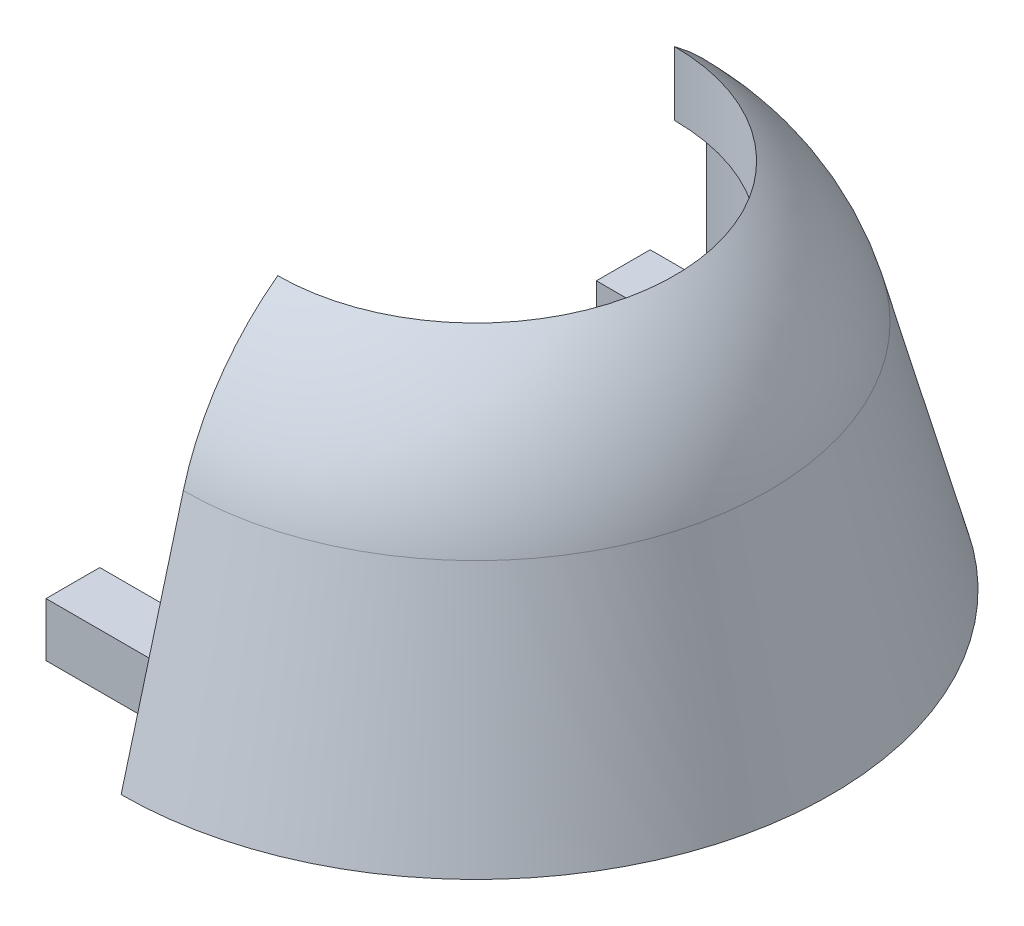
ISO-10303-21;
HEADER;
FILE_DESCRIPTION(('STEP AP214'),'2;1');
FILE_NAME('part.step','',(''),(''),'','','');
FILE_SCHEMA(('AUTOMOTIVE_DESIGN { 1 0 10303 214 1 1 1 1 }'));
ENDSEC;
DATA;
#1=APPLICATION_CONTEXT('core data for automotive mechanical design processes');
#2=APPLICATION_PROTOCOL_DEFINITION('international standard','automotive_design',2000,#1);
#3=PRODUCT_CONTEXT('',#1,'mechanical');
#4=PRODUCT('Part','Part','',(#3));
#5=PRODUCT_RELATED_PRODUCT_CATEGORY('part','',(#4));
#6=PRODUCT_DEFINITION_FORMATION('','',#4);
#7=PRODUCT_DEFINITION_CONTEXT('part definition',#1,'design');
#8=PRODUCT_DEFINITION('design','',#6,#7);
#9=PRODUCT_DEFINITION_SHAPE('','',#8);
#10=(LENGTH_UNIT() NAMED_UNIT(*) SI_UNIT(.MILLI.,.METRE.));
#11=(NAMED_UNIT(*) PLANE_ANGLE_UNIT() SI_UNIT($,.RADIAN.));
#12=(NAMED_UNIT(*) SI_UNIT($,.STERADIAN.) SOLID_ANGLE_UNIT());
#13=UNCERTAINTY_MEASURE_WITH_UNIT(LENGTH_MEASURE(1.E-05),#10,'distance_accuracy_value','');
#14=(GEOMETRIC_REPRESENTATION_CONTEXT(3) GLOBAL_UNCERTAINTY_ASSIGNED_CONTEXT((#13)) GLOBAL_UNIT_ASSIGNED_CONTEXT((#10,
#11,#12)) REPRESENTATION_CONTEXT('',''));
#15=CARTESIAN_POINT('',(0.,0.,0.));
#16=DIRECTION('',(0.,0.,1.));
#17=DIRECTION('',(1.,0.,0.));
#18=AXIS2_PLACEMENT_3D('',#15,#16,#17);
#19=CARTESIAN_POINT('',(0.,24.,18.));
#20=DIRECTION('',(1.,0.,0.));
#21=DIRECTION('',(0.,0.,-1.));
#22=AXIS2_PLACEMENT_3D('',#19,#20,#21);
#23=PLANE('',#22);
#24=DIRECTION('',(0.,-0.965925826289066,0.258819045102528));
#25=VECTOR('',#24,1.);
#26=CARTESIAN_POINT('',(0.,103.497422611925,0.));
#27=LINE('',#26,#25);
#28=CARTESIAN_POINT('',(0.,0.,27.7320508075689));
#29=VERTEX_POINT('',#28);
#30=CARTESIAN_POINT('',(0.,18.1360214514236,22.8725185057462));
#31=VERTEX_POINT('',#30);
#32=EDGE_CURVE('E267',#29,#31,#27,.F.);
#33=ORIENTED_EDGE('',*,*,#32,.T.);
#34=CARTESIAN_POINT('',(0.,12.959640549373,3.55400197996491));
#35=DIRECTION('',(1.,0.,0.));
#36=DIRECTION('',(0.,0.,-1.));
#37=AXIS2_PLACEMENT_3D('',#34,#35,#36);
#38=CIRCLE('',#37,20.);
#39=CARTESIAN_POINT('',(0.,29.,15.5));
#40=VERTEX_POINT('',#39);
#41=EDGE_CURVE('E11',#31,#40,#38,.F.);
#42=ORIENTED_EDGE('',*,*,#41,.T.);
#43=DIRECTION('',(0.,-1.,0.));
#44=VECTOR('',#43,1.);
#45=CARTESIAN_POINT('',(0.,29.,15.5));
#46=LINE('',#45,#44);
#47=CARTESIAN_POINT('',(0.,24.,15.5));
#48=VERTEX_POINT('',#47);
#49=EDGE_CURVE('E222',#40,#48,#46,.T.);
#50=ORIENTED_EDGE('',*,*,#49,.T.);
#51=DIRECTION('',(0.,0.,1.));
#52=VECTOR('',#51,1.);
#53=CARTESIAN_POINT('',(0.,24.,28.));
#54=LINE('',#53,#52);
#55=CARTESIAN_POINT('',(0.,24.,18.));
#56=VERTEX_POINT('',#55);
#57=EDGE_CURVE('E223',#48,#56,#54,.T.);
#58=ORIENTED_EDGE('',*,*,#57,.T.);
#59=DIRECTION('',(0.,-1.,0.));
#60=VECTOR('',#59,1.);
#61=CARTESIAN_POINT('',(0.,24.,18.));
#62=LINE('',#61,#60);
#63=CARTESIAN_POINT('',(0.,0.,18.));
#64=VERTEX_POINT('',#63);
#65=EDGE_CURVE('E244',#56,#64,#62,.T.);
#66=ORIENTED_EDGE('',*,*,#65,.T.);
#67=DIRECTION('',(0.,0.,1.));
#68=VECTOR('',#67,1.);
#69=CARTESIAN_POINT('',(0.,0.,18.));
#70=LINE('',#69,#68);
#71=EDGE_CURVE('E245',#64,#29,#70,.T.);
#72=ORIENTED_EDGE('',*,*,#71,.T.);
#73=EDGE_LOOP('',(#33,#42,#50,#58,#66,#72));
#74=FACE_BOUND('',#73,.T.);
#75=DIRECTION('',(0.,1.,0.));
#76=VECTOR('',#75,1.);
#77=CARTESIAN_POINT('',(0.,6.2,23.6));
#78=LINE('',#77,#76);
#79=CARTESIAN_POINT('',(0.,2.,23.6));
#80=VERTEX_POINT('',#79);
#81=CARTESIAN_POINT('',(0.,6.2,23.6));
#82=VERTEX_POINT('',#81);
#83=EDGE_CURVE('E164',#80,#82,#78,.T.);
#84=ORIENTED_EDGE('',*,*,#83,.F.);
#85=DIRECTION('',(0.,0.,1.));
#86=VECTOR('',#85,1.);
#87=CARTESIAN_POINT('',(0.,2.,19.4));
#88=LINE('',#87,#86);
#89=CARTESIAN_POINT('',(0.,2.,19.4));
#90=VERTEX_POINT('',#89);
#91=EDGE_CURVE('E161',#90,#80,#88,.T.);
#92=ORIENTED_EDGE('',*,*,#91,.F.);
#93=DIRECTION('',(0.,-1.,0.));
#94=VECTOR('',#93,1.);
#95=CARTESIAN_POINT('',(0.,6.2,19.4));
#96=LINE('',#95,#94);
#97=CARTESIAN_POINT('',(0.,6.2,19.4));
#98=VERTEX_POINT('',#97);
#99=EDGE_CURVE('E62',#98,#90,#96,.T.);
#100=ORIENTED_EDGE('',*,*,#99,.F.);
#101=DIRECTION('',(0.,0.,-1.));
#102=VECTOR('',#101,1.);
#103=CARTESIAN_POINT('',(0.,6.2,19.4));
#104=LINE('',#103,#102);
#105=EDGE_CURVE('E57',#82,#98,#104,.T.);
#106=ORIENTED_EDGE('',*,*,#105,.F.);
#107=EDGE_LOOP('',(#84,#92,#100,#106));
#108=FACE_BOUND('',#107,.T.);
#109=ADVANCED_FACE('F41',(#74,#108),#23,.F.);
#110=CARTESIAN_POINT('',(0.,24.,-28.));
#111=DIRECTION('',(1.,0.,0.));
#112=DIRECTION('',(0.,0.,-1.));
#113=AXIS2_PLACEMENT_3D('',#110,#111,#112);
#114=PLANE('',#113);
#115=DIRECTION('',(0.,-1.,0.));
#116=VECTOR('',#115,1.);
#117=CARTESIAN_POINT('',(0.,29.,-15.5));
#118=LINE('',#117,#116);
#119=CARTESIAN_POINT('',(0.,29.,-15.5));
#120=VERTEX_POINT('',#119);
#121=CARTESIAN_POINT('',(0.,24.,-15.5));
#122=VERTEX_POINT('',#121);
#123=EDGE_CURVE('E235',#120,#122,#118,.T.);
#124=ORIENTED_EDGE('',*,*,#123,.F.);
#125=CARTESIAN_POINT('',(0.,12.959640549373,-3.55400197996491));
#126=DIRECTION('',(1.,0.,0.));
#127=DIRECTION('',(0.,0.,-1.));
#128=AXIS2_PLACEMENT_3D('',#125,#126,#127);
#129=CIRCLE('',#128,20.);
#130=CARTESIAN_POINT('',(0.,18.1360214514236,-22.8725185057462));
#131=VERTEX_POINT('',#130);
#132=EDGE_CURVE('E271',#120,#131,#129,.F.);
#133=ORIENTED_EDGE('',*,*,#132,.T.);
#134=DIRECTION('',(0.,0.965925826289066,0.258819045102528));
#135=VECTOR('',#134,1.);
#136=CARTESIAN_POINT('',(0.,103.497422611925,0.));
#137=LINE('',#136,#135);
#138=CARTESIAN_POINT('',(0.,0.,-27.7320508075689));
#139=VERTEX_POINT('',#138);
#140=EDGE_CURVE('E261',#131,#139,#137,.F.);
#141=ORIENTED_EDGE('',*,*,#140,.T.);
#142=DIRECTION('',(0.,0.,1.));
#143=VECTOR('',#142,1.);
#144=CARTESIAN_POINT('',(0.,0.,-28.));
#145=LINE('',#144,#143);
#146=CARTESIAN_POINT('',(0.,0.,-18.));
#147=VERTEX_POINT('',#146);
#148=EDGE_CURVE('E239',#139,#147,#145,.T.);
#149=ORIENTED_EDGE('',*,*,#148,.T.);
#150=DIRECTION('',(0.,-1.,0.));
#151=VECTOR('',#150,1.);
#152=CARTESIAN_POINT('',(0.,24.,-18.));
#153=LINE('',#152,#151);
#154=CARTESIAN_POINT('',(0.,24.,-18.));
#155=VERTEX_POINT('',#154);
#156=EDGE_CURVE('E257',#155,#147,#153,.T.);
#157=ORIENTED_EDGE('',*,*,#156,.F.);
#158=DIRECTION('',(0.,0.,1.));
#159=VECTOR('',#158,1.);
#160=CARTESIAN_POINT('',(0.,24.,-28.));
#161=LINE('',#160,#159);
#162=EDGE_CURVE('E217',#155,#122,#161,.T.);
#163=ORIENTED_EDGE('',*,*,#162,.T.);
#164=EDGE_LOOP('',(#124,#133,#141,#149,#157,#163));
#165=FACE_BOUND('',#164,.T.);
#166=DIRECTION('',(0.,1.,0.));
#167=VECTOR('',#166,1.);
#168=CARTESIAN_POINT('',(0.,6.2,-19.4));
#169=LINE('',#168,#167);
#170=CARTESIAN_POINT('',(0.,2.,-19.4));
#171=VERTEX_POINT('',#170);
#172=CARTESIAN_POINT('',(0.,6.2,-19.4));
#173=VERTEX_POINT('',#172);
#174=EDGE_CURVE('E166',#171,#173,#169,.T.);
#175=ORIENTED_EDGE('',*,*,#174,.F.);
#176=DIRECTION('',(0.,0.,1.));
#177=VECTOR('',#176,1.);
#178=CARTESIAN_POINT('',(0.,2.,-23.6));
#179=LINE('',#178,#177);
#180=CARTESIAN_POINT('',(0.,2.,-23.6));
#181=VERTEX_POINT('',#180);
#182=EDGE_CURVE('E182',#181,#171,#179,.T.);
#183=ORIENTED_EDGE('',*,*,#182,.F.);
#184=DIRECTION('',(0.,-1.,0.));
#185=VECTOR('',#184,1.);
#186=CARTESIAN_POINT('',(0.,6.2,-23.6));
#187=LINE('',#186,#185);
#188=CARTESIAN_POINT('',(0.,6.2,-23.6));
#189=VERTEX_POINT('',#188);
#190=EDGE_CURVE('E195',#189,#181,#187,.T.);
#191=ORIENTED_EDGE('',*,*,#190,.F.);
#192=DIRECTION('',(0.,0.,-1.));
#193=VECTOR('',#192,1.);
#194=CARTESIAN_POINT('',(0.,6.2,-23.6));
#195=LINE('',#194,#193);
#196=EDGE_CURVE('E171',#173,#189,#195,.T.);
#197=ORIENTED_EDGE('',*,*,#196,.F.);
#198=EDGE_LOOP('',(#175,#183,#191,#197));
#199=FACE_BOUND('',#198,.T.);
#200=ADVANCED_FACE('F302',(#165,#199),#114,.F.);
#201=CARTESIAN_POINT('',(0.,24.,0.));
#202=DIRECTION('',(0.,-1.,0.));
#203=DIRECTION('',(0.,0.,-1.));
#204=AXIS2_PLACEMENT_3D('',#201,#202,#203);
#205=CYLINDRICAL_SURFACE('',#204,18.);
#206=CARTESIAN_POINT('',(0.,0.,0.));
#207=DIRECTION('',(0.,-1.,0.));
#208=DIRECTION('',(0.,0.,1.));
#209=AXIS2_PLACEMENT_3D('',#206,#207,#208);
#210=CIRCLE('',#209,18.);
#211=EDGE_CURVE('E248',#147,#64,#210,.T.);
#212=ORIENTED_EDGE('',*,*,#211,.T.);
#213=ORIENTED_EDGE('',*,*,#65,.F.);
#214=CARTESIAN_POINT('',(0.,24.,0.));
#215=DIRECTION('',(0.,-1.,0.));
#216=DIRECTION('',(0.,0.,1.));
#217=AXIS2_PLACEMENT_3D('',#214,#215,#216);
#218=CIRCLE('',#217,18.);
#219=EDGE_CURVE('E240',#155,#56,#218,.T.);
#220=ORIENTED_EDGE('',*,*,#219,.F.);
#221=ORIENTED_EDGE('',*,*,#156,.T.);
#222=EDGE_LOOP('',(#212,#213,#220,#221));
#223=FACE_BOUND('',#222,.T.);
#224=ADVANCED_FACE('F296',(#223),#205,.F.);
#225=CARTESIAN_POINT('',(0.,0.,0.));
#226=DIRECTION('',(0.,1.,0.));
#227=DIRECTION('',(0.,0.,1.));
#228=AXIS2_PLACEMENT_3D('',#225,#226,#227);
#229=PLANE('',#228);
#230=ORIENTED_EDGE('',*,*,#148,.F.);
#231=CARTESIAN_POINT('',(0.,0.,0.));
#232=DIRECTION('',(0.,1.,0.));
#233=DIRECTION('',(0.,0.,1.));
#234=AXIS2_PLACEMENT_3D('',#231,#232,#233);
#235=CIRCLE('',#234,27.7320508075689);
#236=EDGE_CURVE('E264',#139,#29,#235,.F.);
#237=ORIENTED_EDGE('',*,*,#236,.T.);
#238=ORIENTED_EDGE('',*,*,#71,.F.);
#239=ORIENTED_EDGE('',*,*,#211,.F.);
#240=EDGE_LOOP('',(#230,#237,#238,#239));
#241=FACE_BOUND('',#240,.T.);
#242=ADVANCED_FACE('F300',(#241),#229,.F.);
#243=CARTESIAN_POINT('',(0.,24.,0.));
#244=DIRECTION('',(0.,1.,0.));
#245=DIRECTION('',(0.,0.,1.));
#246=AXIS2_PLACEMENT_3D('',#243,#244,#245);
#247=PLANE('',#246);
#248=ORIENTED_EDGE('',*,*,#162,.F.);
#249=ORIENTED_EDGE('',*,*,#219,.T.);
#250=ORIENTED_EDGE('',*,*,#57,.F.);
#251=CARTESIAN_POINT('',(0.,24.,0.));
#252=DIRECTION('',(0.,-1.,0.));
#253=DIRECTION('',(0.,0.,1.));
#254=AXIS2_PLACEMENT_3D('',#251,#252,#253);
#255=CIRCLE('',#254,15.5);
#256=EDGE_CURVE('E226',#122,#48,#255,.T.);
#257=ORIENTED_EDGE('',*,*,#256,.F.);
#258=EDGE_LOOP('',(#248,#249,#250,#257));
#259=FACE_BOUND('',#258,.T.);
#260=ADVANCED_FACE('F293',(#259),#247,.F.);
#261=CARTESIAN_POINT('',(0.,29.,0.));
#262=DIRECTION('',(0.,-1.,0.));
#263=DIRECTION('',(0.,0.,-1.));
#264=AXIS2_PLACEMENT_3D('',#261,#262,#263);
#265=CYLINDRICAL_SURFACE('',#264,15.5);
#266=ORIENTED_EDGE('',*,*,#256,.T.);
#267=ORIENTED_EDGE('',*,*,#49,.F.);
#268=CARTESIAN_POINT('',(0.,29.,0.));
#269=DIRECTION('',(0.,-1.,0.));
#270=DIRECTION('',(0.,0.,1.));
#271=AXIS2_PLACEMENT_3D('',#268,#269,#270);
#272=CIRCLE('',#271,15.5);
#273=EDGE_CURVE('E218',#120,#40,#272,.T.);
#274=ORIENTED_EDGE('',*,*,#273,.F.);
#275=ORIENTED_EDGE('',*,*,#123,.T.);
#276=EDGE_LOOP('',(#266,#267,#274,#275));
#277=FACE_BOUND('',#276,.T.);
#278=ADVANCED_FACE('F288',(#277),#265,.F.);
#279=CARTESIAN_POINT('',(0.,29.,0.));
#280=DIRECTION('',(0.,-1.,0.));
#281=DIRECTION('',(0.,0.,-1.));
#282=AXIS2_PLACEMENT_3D('',#279,#280,#281);
#283=CONICAL_SURFACE('',#282,19.9615242270661,0.261799387799157);
#284=ORIENTED_EDGE('',*,*,#140,.F.);
#285=CARTESIAN_POINT('',(0.,18.1360214514236,0.));
#286=DIRECTION('',(0.,-1.,0.));
#287=DIRECTION('',(0.,0.,-1.));
#288=AXIS2_PLACEMENT_3D('',#285,#286,#287);
#289=CIRCLE('',#288,22.8725185057462);
#290=EDGE_CURVE('E50',#131,#31,#289,.T.);
#291=ORIENTED_EDGE('',*,*,#290,.T.);
#292=ORIENTED_EDGE('',*,*,#32,.F.);
#293=ORIENTED_EDGE('',*,*,#236,.F.);
#294=EDGE_LOOP('',(#284,#291,#292,#293));
#295=FACE_BOUND('',#294,.T.);
#296=ADVANCED_FACE('F278',(#295),#283,.T.);
#297=CARTESIAN_POINT('',(0.,12.959640549373,0.));
#298=DIRECTION('',(0.,1.,0.));
#299=DIRECTION('',(0.,0.,1.));
#300=AXIS2_PLACEMENT_3D('',#297,#298,#299);
#301=DEGENERATE_TOROIDAL_SURFACE('',#300,3.55400197996491,20.,.T.);
#302=ORIENTED_EDGE('',*,*,#41,.F.);
#303=ORIENTED_EDGE('',*,*,#290,.F.);
#304=ORIENTED_EDGE('',*,*,#132,.F.);
#305=ORIENTED_EDGE('',*,*,#273,.T.);
#306=EDGE_LOOP('',(#302,#303,#304,#305));
#307=FACE_BOUND('',#306,.T.);
#308=ADVANCED_FACE('F43',(#307),#301,.T.);
#309=CARTESIAN_POINT('',(-9.99999999999999,6.2,-19.4));
#310=DIRECTION('',(0.,0.,-1.));
#311=DIRECTION('',(-1.,0.,0.));
#312=AXIS2_PLACEMENT_3D('',#309,#310,#311);
#313=PLANE('',#312);
#314=ORIENTED_EDGE('',*,*,#174,.T.);
#315=DIRECTION('',(1.,0.,0.));
#316=VECTOR('',#315,1.);
#317=CARTESIAN_POINT('',(-9.99999999999999,6.2,-19.4));
#318=LINE('',#317,#316);
#319=CARTESIAN_POINT('',(-9.99999999999999,6.2,-19.4));
#320=VERTEX_POINT('',#319);
#321=EDGE_CURVE('E213',#320,#173,#318,.T.);
#322=ORIENTED_EDGE('',*,*,#321,.F.);
#323=DIRECTION('',(0.,1.,0.));
#324=VECTOR('',#323,1.);
#325=CARTESIAN_POINT('',(-9.99999999999999,6.2,-19.4));
#326=LINE('',#325,#324);
#327=CARTESIAN_POINT('',(-9.99999999999999,2.,-19.4));
#328=VERTEX_POINT('',#327);
#329=EDGE_CURVE('E177',#328,#320,#326,.T.);
#330=ORIENTED_EDGE('',*,*,#329,.F.);
#331=DIRECTION('',(1.,0.,0.));
#332=VECTOR('',#331,1.);
#333=CARTESIAN_POINT('',(-9.99999999999999,2.,-19.4));
#334=LINE('',#333,#332);
#335=EDGE_CURVE('E190',#328,#171,#334,.T.);
#336=ORIENTED_EDGE('',*,*,#335,.T.);
#337=EDGE_LOOP('',(#314,#322,#330,#336));
#338=FACE_BOUND('',#337,.T.);
#339=ADVANCED_FACE('F314',(#338),#313,.F.);
#340=CARTESIAN_POINT('',(-9.99999999999999,6.2,-23.6));
#341=DIRECTION('',(0.,-1.,0.));
#342=DIRECTION('',(0.,0.,-1.));
#343=AXIS2_PLACEMENT_3D('',#340,#341,#342);
#344=PLANE('',#343);
#345=ORIENTED_EDGE('',*,*,#196,.T.);
#346=DIRECTION('',(1.,0.,0.));
#347=VECTOR('',#346,1.);
#348=CARTESIAN_POINT('',(-9.99999999999999,6.2,-23.6));
#349=LINE('',#348,#347);
#350=CARTESIAN_POINT('',(-9.99999999999999,6.2,-23.6));
#351=VERTEX_POINT('',#350);
#352=EDGE_CURVE('E209',#351,#189,#349,.T.);
#353=ORIENTED_EDGE('',*,*,#352,.F.);
#354=DIRECTION('',(0.,0.,-1.));
#355=VECTOR('',#354,1.);
#356=CARTESIAN_POINT('',(-9.99999999999999,6.2,-23.6));
#357=LINE('',#356,#355);
#358=EDGE_CURVE('E181',#320,#351,#357,.T.);
#359=ORIENTED_EDGE('',*,*,#358,.F.);
#360=ORIENTED_EDGE('',*,*,#321,.T.);
#361=EDGE_LOOP('',(#345,#353,#359,#360));
#362=FACE_BOUND('',#361,.T.);
#363=ADVANCED_FACE('F322',(#362),#344,.F.);
#364=CARTESIAN_POINT('',(-9.99999999999999,6.2,-23.6));
#365=DIRECTION('',(0.,0.,1.));
#366=DIRECTION('',(1.,0.,0.));
#367=AXIS2_PLACEMENT_3D('',#364,#365,#366);
#368=PLANE('',#367);
#369=ORIENTED_EDGE('',*,*,#190,.T.);
#370=DIRECTION('',(1.,0.,0.));
#371=VECTOR('',#370,1.);
#372=CARTESIAN_POINT('',(-9.99999999999999,2.,-23.6));
#373=LINE('',#372,#371);
#374=CARTESIAN_POINT('',(-9.99999999999999,2.,-23.6));
#375=VERTEX_POINT('',#374);
#376=EDGE_CURVE('E205',#375,#181,#373,.T.);
#377=ORIENTED_EDGE('',*,*,#376,.F.);
#378=DIRECTION('',(0.,-1.,0.));
#379=VECTOR('',#378,1.);
#380=CARTESIAN_POINT('',(-9.99999999999999,6.2,-23.6));
#381=LINE('',#380,#379);
#382=EDGE_CURVE('E185',#351,#375,#381,.T.);
#383=ORIENTED_EDGE('',*,*,#382,.F.);
#384=ORIENTED_EDGE('',*,*,#352,.T.);
#385=EDGE_LOOP('',(#369,#377,#383,#384));
#386=FACE_BOUND('',#385,.T.);
#387=ADVANCED_FACE('F320',(#386),#368,.F.);
#388=CARTESIAN_POINT('',(-9.99999999999999,2.,-23.6));
#389=DIRECTION('',(0.,1.,0.));
#390=DIRECTION('',(0.,0.,1.));
#391=AXIS2_PLACEMENT_3D('',#388,#389,#390);
#392=PLANE('',#391);
#393=ORIENTED_EDGE('',*,*,#182,.T.);
#394=ORIENTED_EDGE('',*,*,#335,.F.);
#395=DIRECTION('',(0.,0.,1.));
#396=VECTOR('',#395,1.);
#397=CARTESIAN_POINT('',(-9.99999999999999,2.,-23.6));
#398=LINE('',#397,#396);
#399=EDGE_CURVE('E188',#375,#328,#398,.T.);
#400=ORIENTED_EDGE('',*,*,#399,.F.);
#401=ORIENTED_EDGE('',*,*,#376,.T.);
#402=EDGE_LOOP('',(#393,#394,#400,#401));
#403=FACE_BOUND('',#402,.T.);
#404=ADVANCED_FACE('F310',(#403),#392,.F.);
#405=CARTESIAN_POINT('',(-10.,0.,0.));
#406=DIRECTION('',(-1.,0.,0.));
#407=DIRECTION('',(0.,0.,1.));
#408=AXIS2_PLACEMENT_3D('',#405,#406,#407);
#409=PLANE('',#408);
#410=ORIENTED_EDGE('',*,*,#329,.T.);
#411=ORIENTED_EDGE('',*,*,#358,.T.);
#412=ORIENTED_EDGE('',*,*,#382,.T.);
#413=ORIENTED_EDGE('',*,*,#399,.T.);
#414=EDGE_LOOP('',(#410,#411,#412,#413));
#415=FACE_BOUND('',#414,.T.);
#416=ADVANCED_FACE('F316',(#415),#409,.T.);
#417=CARTESIAN_POINT('',(-10.,6.2,23.6));
#418=DIRECTION('',(0.,0.,-1.));
#419=DIRECTION('',(-1.,0.,0.));
#420=AXIS2_PLACEMENT_3D('',#417,#418,#419);
#421=PLANE('',#420);
#422=ORIENTED_EDGE('',*,*,#83,.T.);
#423=DIRECTION('',(1.,0.,0.));
#424=VECTOR('',#423,1.);
#425=CARTESIAN_POINT('',(-10.,6.2,23.6));
#426=LINE('',#425,#424);
#427=CARTESIAN_POINT('',(-10.,6.2,23.6));
#428=VERTEX_POINT('',#427);
#429=EDGE_CURVE('E143',#428,#82,#426,.T.);
#430=ORIENTED_EDGE('',*,*,#429,.F.);
#431=DIRECTION('',(0.,1.,0.));
#432=VECTOR('',#431,1.);
#433=CARTESIAN_POINT('',(-10.,6.2,23.6));
#434=LINE('',#433,#432);
#435=CARTESIAN_POINT('',(-10.,2.,23.6));
#436=VERTEX_POINT('',#435);
#437=EDGE_CURVE('E151',#436,#428,#434,.T.);
#438=ORIENTED_EDGE('',*,*,#437,.F.);
#439=DIRECTION('',(1.,0.,0.));
#440=VECTOR('',#439,1.);
#441=CARTESIAN_POINT('',(-10.,2.,23.6));
#442=LINE('',#441,#440);
#443=EDGE_CURVE('E451',#436,#80,#442,.T.);
#444=ORIENTED_EDGE('',*,*,#443,.T.);
#445=EDGE_LOOP('',(#422,#430,#438,#444));
#446=FACE_BOUND('',#445,.T.);
#447=ADVANCED_FACE('F163',(#446),#421,.F.);
#448=CARTESIAN_POINT('',(-10.,6.2,19.4));
#449=DIRECTION('',(0.,-1.,0.));
#450=DIRECTION('',(0.,0.,-1.));
#451=AXIS2_PLACEMENT_3D('',#448,#449,#450);
#452=PLANE('',#451);
#453=ORIENTED_EDGE('',*,*,#105,.T.);
#454=DIRECTION('',(1.,0.,0.));
#455=VECTOR('',#454,1.);
#456=CARTESIAN_POINT('',(-10.,6.2,19.4));
#457=LINE('',#456,#455);
#458=CARTESIAN_POINT('',(-10.,6.2,19.4));
#459=VERTEX_POINT('',#458);
#460=EDGE_CURVE('E146',#459,#98,#457,.T.);
#461=ORIENTED_EDGE('',*,*,#460,.F.);
#462=DIRECTION('',(0.,0.,-1.));
#463=VECTOR('',#462,1.);
#464=CARTESIAN_POINT('',(-10.,6.2,19.4));
#465=LINE('',#464,#463);
#466=EDGE_CURVE('E139',#428,#459,#465,.T.);
#467=ORIENTED_EDGE('',*,*,#466,.F.);
#468=ORIENTED_EDGE('',*,*,#429,.T.);
#469=EDGE_LOOP('',(#453,#461,#467,#468));
#470=FACE_BOUND('',#469,.T.);
#471=ADVANCED_FACE('F141',(#470),#452,.F.);
#472=CARTESIAN_POINT('',(-10.,6.2,19.4));
#473=DIRECTION('',(0.,0.,1.));
#474=DIRECTION('',(1.,0.,0.));
#475=AXIS2_PLACEMENT_3D('',#472,#473,#474);
#476=PLANE('',#475);
#477=ORIENTED_EDGE('',*,*,#99,.T.);
#478=DIRECTION('',(1.,0.,0.));
#479=VECTOR('',#478,1.);
#480=CARTESIAN_POINT('',(-10.,2.,19.4));
#481=LINE('',#480,#479);
#482=CARTESIAN_POINT('',(-10.,2.,19.4));
#483=VERTEX_POINT('',#482);
#484=EDGE_CURVE('E173',#483,#90,#481,.T.);
#485=ORIENTED_EDGE('',*,*,#484,.F.);
#486=DIRECTION('',(0.,-1.,0.));
#487=VECTOR('',#486,1.);
#488=CARTESIAN_POINT('',(-10.,6.2,19.4));
#489=LINE('',#488,#487);
#490=EDGE_CURVE('E150',#459,#483,#489,.T.);
#491=ORIENTED_EDGE('',*,*,#490,.F.);
#492=ORIENTED_EDGE('',*,*,#460,.T.);
#493=EDGE_LOOP('',(#477,#485,#491,#492));
#494=FACE_BOUND('',#493,.T.);
#495=ADVANCED_FACE('F418',(#494),#476,.F.);
#496=CARTESIAN_POINT('',(-10.,2.,19.4));
#497=DIRECTION('',(0.,1.,0.));
#498=DIRECTION('',(0.,0.,1.));
#499=AXIS2_PLACEMENT_3D('',#496,#497,#498);
#500=PLANE('',#499);
#501=ORIENTED_EDGE('',*,*,#91,.T.);
#502=ORIENTED_EDGE('',*,*,#443,.F.);
#503=DIRECTION('',(0.,0.,1.));
#504=VECTOR('',#503,1.);
#505=CARTESIAN_POINT('',(-10.,2.,19.4));
#506=LINE('',#505,#504);
#507=EDGE_CURVE('E156',#483,#436,#506,.T.);
#508=ORIENTED_EDGE('',*,*,#507,.F.);
#509=ORIENTED_EDGE('',*,*,#484,.T.);
#510=EDGE_LOOP('',(#501,#502,#508,#509));
#511=FACE_BOUND('',#510,.T.);
#512=ADVANCED_FACE('F427',(#511),#500,.F.);
#513=CARTESIAN_POINT('',(-10.,0.,0.));
#514=DIRECTION('',(-1.,0.,0.));
#515=DIRECTION('',(0.,0.,1.));
#516=AXIS2_PLACEMENT_3D('',#513,#514,#515);
#517=PLANE('',#516);
#518=ORIENTED_EDGE('',*,*,#437,.T.);
#519=ORIENTED_EDGE('',*,*,#466,.T.);
#520=ORIENTED_EDGE('',*,*,#490,.T.);
#521=ORIENTED_EDGE('',*,*,#507,.T.);
#522=EDGE_LOOP('',(#518,#519,#520,#521));
#523=FACE_BOUND('',#522,.T.);
#524=ADVANCED_FACE('F154',(#523),#517,.T.);
#525=CLOSED_SHELL('',(#109,#200,#224,#242,#260,#278,#296,#308,#339,#363,#387,#404,#416,#447,
#471,#495,#512,#524));
#526=MANIFOLD_SOLID_BREP('B2',#525);
#527=ADVANCED_BREP_SHAPE_REPRESENTATION('',(#18,#526),#14);
#528=SHAPE_DEFINITION_REPRESENTATION(#9,#527);
ENDSEC;
END-ISO-10303-21;
